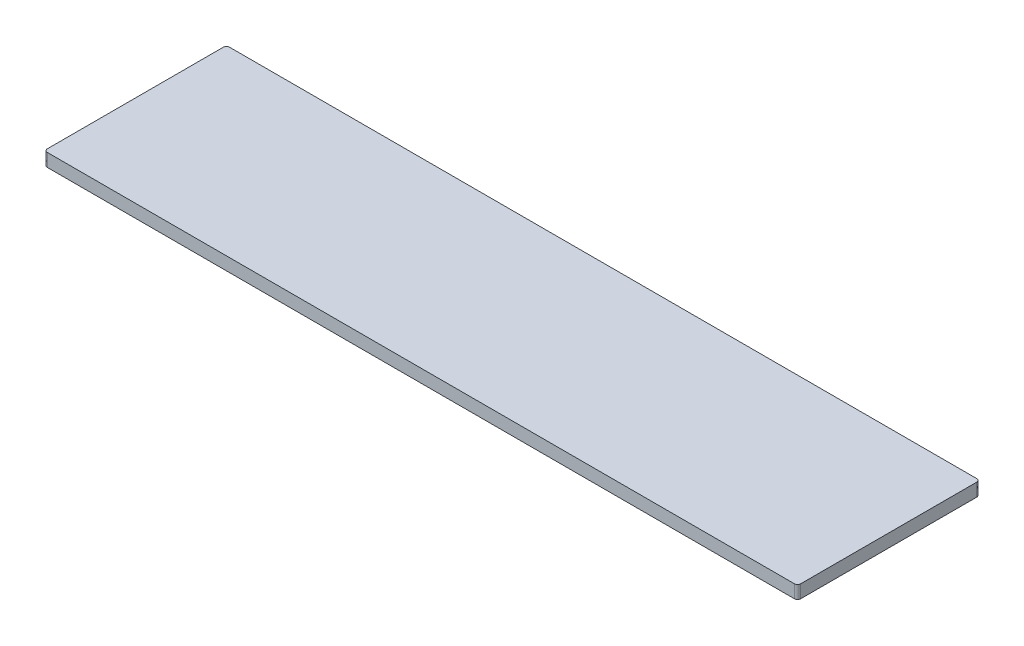
ISO-10303-21;
HEADER;
FILE_DESCRIPTION(('STEP AP214'),'2;1');
FILE_NAME('part.step','',(''),(''),'','','');
FILE_SCHEMA(('AUTOMOTIVE_DESIGN { 1 0 10303 214 1 1 1 1 }'));
ENDSEC;
DATA;
#1=APPLICATION_CONTEXT('core data for automotive mechanical design processes');
#2=APPLICATION_PROTOCOL_DEFINITION('international standard','automotive_design',2000,#1);
#3=PRODUCT_CONTEXT('',#1,'mechanical');
#4=PRODUCT('Part','Part','',(#3));
#5=PRODUCT_RELATED_PRODUCT_CATEGORY('part','',(#4));
#6=PRODUCT_DEFINITION_FORMATION('','',#4);
#7=PRODUCT_DEFINITION_CONTEXT('part definition',#1,'design');
#8=PRODUCT_DEFINITION('design','',#6,#7);
#9=PRODUCT_DEFINITION_SHAPE('','',#8);
#10=(LENGTH_UNIT() NAMED_UNIT(*) SI_UNIT(.MILLI.,.METRE.));
#11=(NAMED_UNIT(*) PLANE_ANGLE_UNIT() SI_UNIT($,.RADIAN.));
#12=(NAMED_UNIT(*) SI_UNIT($,.STERADIAN.) SOLID_ANGLE_UNIT());
#13=UNCERTAINTY_MEASURE_WITH_UNIT(LENGTH_MEASURE(1.E-05),#10,'distance_accuracy_value','');
#14=(GEOMETRIC_REPRESENTATION_CONTEXT(3) GLOBAL_UNCERTAINTY_ASSIGNED_CONTEXT((#13)) GLOBAL_UNIT_ASSIGNED_CONTEXT((#10,
#11,#12)) REPRESENTATION_CONTEXT('',''));
#15=CARTESIAN_POINT('',(0.,0.,0.));
#16=DIRECTION('',(0.,0.,1.));
#17=DIRECTION('',(1.,0.,0.));
#18=AXIS2_PLACEMENT_3D('',#15,#16,#17);
#19=CARTESIAN_POINT('',(367.5,12.7,88.9));
#20=DIRECTION('',(-1.,0.,0.));
#21=DIRECTION('',(0.,0.,1.));
#22=AXIS2_PLACEMENT_3D('',#19,#20,#21);
#23=PLANE('',#22);
#24=DIRECTION('',(0.,0.,-1.));
#25=VECTOR('',#24,1.);
#26=CARTESIAN_POINT('',(367.5,0.,88.9));
#27=LINE('',#26,#25);
#28=CARTESIAN_POINT('',(367.5,0.,85.9));
#29=VERTEX_POINT('',#28);
#30=CARTESIAN_POINT('',(367.5,0.,-85.9));
#31=VERTEX_POINT('',#30);
#32=EDGE_CURVE('E184',#29,#31,#27,.T.);
#33=ORIENTED_EDGE('',*,*,#32,.T.);
#34=DIRECTION('',(0.,-1.,0.));
#35=VECTOR('',#34,1.);
#36=CARTESIAN_POINT('',(367.5,12.7,-85.9));
#37=LINE('',#36,#35);
#38=CARTESIAN_POINT('',(367.5,12.7,-85.9));
#39=VERTEX_POINT('',#38);
#40=EDGE_CURVE('E11',#31,#39,#37,.F.);
#41=ORIENTED_EDGE('',*,*,#40,.T.);
#42=DIRECTION('',(0.,0.,-1.));
#43=VECTOR('',#42,1.);
#44=CARTESIAN_POINT('',(367.5,12.7,88.9));
#45=LINE('',#44,#43);
#46=CARTESIAN_POINT('',(367.5,12.7,85.9));
#47=VERTEX_POINT('',#46);
#48=EDGE_CURVE('E137',#47,#39,#45,.T.);
#49=ORIENTED_EDGE('',*,*,#48,.F.);
#50=DIRECTION('',(0.,-1.,0.));
#51=VECTOR('',#50,1.);
#52=CARTESIAN_POINT('',(367.5,12.7,85.9));
#53=LINE('',#52,#51);
#54=EDGE_CURVE('E50',#47,#29,#53,.T.);
#55=ORIENTED_EDGE('',*,*,#54,.T.);
#56=EDGE_LOOP('',(#33,#41,#49,#55));
#57=FACE_BOUND('',#56,.T.);
#58=ADVANCED_FACE('F41',(#57),#23,.F.);
#59=CARTESIAN_POINT('',(-367.5,12.7,-88.9));
#60=DIRECTION('',(0.,0.,1.));
#61=DIRECTION('',(1.,0.,0.));
#62=AXIS2_PLACEMENT_3D('',#59,#60,#61);
#63=PLANE('',#62);
#64=DIRECTION('',(-1.,0.,0.));
#65=VECTOR('',#64,1.);
#66=CARTESIAN_POINT('',(-367.5,0.,-88.9));
#67=LINE('',#66,#65);
#68=CARTESIAN_POINT('',(364.5,0.,-88.9));
#69=VERTEX_POINT('',#68);
#70=CARTESIAN_POINT('',(-364.5,0.,-88.9));
#71=VERTEX_POINT('',#70);
#72=EDGE_CURVE('E144',#69,#71,#67,.T.);
#73=ORIENTED_EDGE('',*,*,#72,.T.);
#74=DIRECTION('',(0.,-1.,0.));
#75=VECTOR('',#74,1.);
#76=CARTESIAN_POINT('',(-364.5,12.7,-88.9));
#77=LINE('',#76,#75);
#78=CARTESIAN_POINT('',(-364.5,12.7,-88.9));
#79=VERTEX_POINT('',#78);
#80=EDGE_CURVE('E57',#71,#79,#77,.F.);
#81=ORIENTED_EDGE('',*,*,#80,.T.);
#82=DIRECTION('',(-1.,0.,0.));
#83=VECTOR('',#82,1.);
#84=CARTESIAN_POINT('',(-367.5,12.7,-88.9));
#85=LINE('',#84,#83);
#86=CARTESIAN_POINT('',(364.5,12.7,-88.9));
#87=VERTEX_POINT('',#86);
#88=EDGE_CURVE('E142',#87,#79,#85,.T.);
#89=ORIENTED_EDGE('',*,*,#88,.F.);
#90=DIRECTION('',(0.,-1.,0.));
#91=VECTOR('',#90,1.);
#92=CARTESIAN_POINT('',(364.5,12.7,-88.9));
#93=LINE('',#92,#91);
#94=EDGE_CURVE('E173',#87,#69,#93,.T.);
#95=ORIENTED_EDGE('',*,*,#94,.T.);
#96=EDGE_LOOP('',(#73,#81,#89,#95));
#97=FACE_BOUND('',#96,.T.);
#98=ADVANCED_FACE('F209',(#97),#63,.F.);
#99=CARTESIAN_POINT('',(-367.5,12.7,88.9));
#100=DIRECTION('',(1.,0.,0.));
#101=DIRECTION('',(0.,0.,-1.));
#102=AXIS2_PLACEMENT_3D('',#99,#100,#101);
#103=PLANE('',#102);
#104=DIRECTION('',(0.,0.,1.));
#105=VECTOR('',#104,1.);
#106=CARTESIAN_POINT('',(-367.5,0.,88.9));
#107=LINE('',#106,#105);
#108=CARTESIAN_POINT('',(-367.5,0.,-85.9));
#109=VERTEX_POINT('',#108);
#110=CARTESIAN_POINT('',(-367.5,0.,85.9));
#111=VERTEX_POINT('',#110);
#112=EDGE_CURVE('E138',#109,#111,#107,.T.);
#113=ORIENTED_EDGE('',*,*,#112,.T.);
#114=DIRECTION('',(0.,-1.,0.));
#115=VECTOR('',#114,1.);
#116=CARTESIAN_POINT('',(-367.5,12.7,85.9));
#117=LINE('',#116,#115);
#118=CARTESIAN_POINT('',(-367.5,12.7,85.9));
#119=VERTEX_POINT('',#118);
#120=EDGE_CURVE('E113',#111,#119,#117,.F.);
#121=ORIENTED_EDGE('',*,*,#120,.T.);
#122=DIRECTION('',(0.,0.,1.));
#123=VECTOR('',#122,1.);
#124=CARTESIAN_POINT('',(-367.5,12.7,88.9));
#125=LINE('',#124,#123);
#126=CARTESIAN_POINT('',(-367.5,12.7,-85.9));
#127=VERTEX_POINT('',#126);
#128=EDGE_CURVE('E195',#127,#119,#125,.T.);
#129=ORIENTED_EDGE('',*,*,#128,.F.);
#130=DIRECTION('',(0.,-1.,0.));
#131=VECTOR('',#130,1.);
#132=CARTESIAN_POINT('',(-367.5,12.7,-85.9));
#133=LINE('',#132,#131);
#134=EDGE_CURVE('E119',#127,#109,#133,.T.);
#135=ORIENTED_EDGE('',*,*,#134,.T.);
#136=EDGE_LOOP('',(#113,#121,#129,#135));
#137=FACE_BOUND('',#136,.T.);
#138=ADVANCED_FACE('F208',(#137),#103,.F.);
#139=CARTESIAN_POINT('',(-367.5,12.7,88.9));
#140=DIRECTION('',(0.,0.,-1.));
#141=DIRECTION('',(-1.,0.,0.));
#142=AXIS2_PLACEMENT_3D('',#139,#140,#141);
#143=PLANE('',#142);
#144=DIRECTION('',(1.,0.,0.));
#145=VECTOR('',#144,1.);
#146=CARTESIAN_POINT('',(-367.5,12.7,88.9));
#147=LINE('',#146,#145);
#148=CARTESIAN_POINT('',(-364.5,12.7,88.9));
#149=VERTEX_POINT('',#148);
#150=CARTESIAN_POINT('',(364.5,12.7,88.9));
#151=VERTEX_POINT('',#150);
#152=EDGE_CURVE('E129',#149,#151,#147,.T.);
#153=ORIENTED_EDGE('',*,*,#152,.F.);
#154=DIRECTION('',(0.,-1.,0.));
#155=VECTOR('',#154,1.);
#156=CARTESIAN_POINT('',(-364.5,12.7,88.9));
#157=LINE('',#156,#155);
#158=CARTESIAN_POINT('',(-364.5,0.,88.9));
#159=VERTEX_POINT('',#158);
#160=EDGE_CURVE('E112',#149,#159,#157,.T.);
#161=ORIENTED_EDGE('',*,*,#160,.T.);
#162=DIRECTION('',(1.,0.,0.));
#163=VECTOR('',#162,1.);
#164=CARTESIAN_POINT('',(-367.5,0.,88.9));
#165=LINE('',#164,#163);
#166=CARTESIAN_POINT('',(364.5,0.,88.9));
#167=VERTEX_POINT('',#166);
#168=EDGE_CURVE('E126',#159,#167,#165,.T.);
#169=ORIENTED_EDGE('',*,*,#168,.T.);
#170=DIRECTION('',(0.,-1.,0.));
#171=VECTOR('',#170,1.);
#172=CARTESIAN_POINT('',(364.5,12.7,88.9));
#173=LINE('',#172,#171);
#174=EDGE_CURVE('E132',#167,#151,#173,.F.);
#175=ORIENTED_EDGE('',*,*,#174,.T.);
#176=EDGE_LOOP('',(#153,#161,#169,#175));
#177=FACE_BOUND('',#176,.T.);
#178=ADVANCED_FACE('F125',(#177),#143,.F.);
#179=CARTESIAN_POINT('',(0.,12.7,0.));
#180=DIRECTION('',(0.,-1.,0.));
#181=DIRECTION('',(0.,0.,-1.));
#182=AXIS2_PLACEMENT_3D('',#179,#180,#181);
#183=PLANE('',#182);
#184=ORIENTED_EDGE('',*,*,#128,.T.);
#185=CARTESIAN_POINT('',(-364.5,12.7,85.9));
#186=DIRECTION('',(0.,-1.,0.));
#187=DIRECTION('',(0.,0.,-1.));
#188=AXIS2_PLACEMENT_3D('',#185,#186,#187);
#189=CIRCLE('',#188,3.);
#190=EDGE_CURVE('E170',#119,#149,#189,.F.);
#191=ORIENTED_EDGE('',*,*,#190,.T.);
#192=ORIENTED_EDGE('',*,*,#152,.T.);
#193=CARTESIAN_POINT('',(364.5,12.7,85.9));
#194=DIRECTION('',(0.,-1.,0.));
#195=DIRECTION('',(0.,0.,-1.));
#196=AXIS2_PLACEMENT_3D('',#193,#194,#195);
#197=CIRCLE('',#196,3.);
#198=EDGE_CURVE('E162',#151,#47,#197,.F.);
#199=ORIENTED_EDGE('',*,*,#198,.T.);
#200=ORIENTED_EDGE('',*,*,#48,.T.);
#201=CARTESIAN_POINT('',(364.5,12.7,-85.9));
#202=DIRECTION('',(0.,-1.,0.));
#203=DIRECTION('',(0.,0.,-1.));
#204=AXIS2_PLACEMENT_3D('',#201,#202,#203);
#205=CIRCLE('',#204,3.);
#206=EDGE_CURVE('E64',#39,#87,#205,.F.);
#207=ORIENTED_EDGE('',*,*,#206,.T.);
#208=ORIENTED_EDGE('',*,*,#88,.T.);
#209=CARTESIAN_POINT('',(-364.5,12.7,-85.9));
#210=DIRECTION('',(0.,-1.,0.));
#211=DIRECTION('',(0.,0.,-1.));
#212=AXIS2_PLACEMENT_3D('',#209,#210,#211);
#213=CIRCLE('',#212,3.);
#214=EDGE_CURVE('E167',#79,#127,#213,.F.);
#215=ORIENTED_EDGE('',*,*,#214,.T.);
#216=EDGE_LOOP('',(#184,#191,#192,#199,#200,#207,#208,#215));
#217=FACE_BOUND('',#216,.T.);
#218=ADVANCED_FACE('F201',(#217),#183,.F.);
#219=CARTESIAN_POINT('',(0.,0.,0.));
#220=DIRECTION('',(0.,-1.,0.));
#221=DIRECTION('',(0.,0.,-1.));
#222=AXIS2_PLACEMENT_3D('',#219,#220,#221);
#223=PLANE('',#222);
#224=ORIENTED_EDGE('',*,*,#168,.F.);
#225=CARTESIAN_POINT('',(-364.5,0.,85.9));
#226=DIRECTION('',(0.,-1.,0.));
#227=DIRECTION('',(0.,0.,-1.));
#228=AXIS2_PLACEMENT_3D('',#225,#226,#227);
#229=CIRCLE('',#228,3.);
#230=EDGE_CURVE('E108',#159,#111,#229,.T.);
#231=ORIENTED_EDGE('',*,*,#230,.T.);
#232=ORIENTED_EDGE('',*,*,#112,.F.);
#233=CARTESIAN_POINT('',(-364.5,0.,-85.9));
#234=DIRECTION('',(0.,-1.,0.));
#235=DIRECTION('',(0.,0.,-1.));
#236=AXIS2_PLACEMENT_3D('',#233,#234,#235);
#237=CIRCLE('',#236,3.);
#238=EDGE_CURVE('E120',#109,#71,#237,.T.);
#239=ORIENTED_EDGE('',*,*,#238,.T.);
#240=ORIENTED_EDGE('',*,*,#72,.F.);
#241=CARTESIAN_POINT('',(364.5,0.,-85.9));
#242=DIRECTION('',(0.,-1.,0.));
#243=DIRECTION('',(0.,0.,-1.));
#244=AXIS2_PLACEMENT_3D('',#241,#242,#243);
#245=CIRCLE('',#244,3.);
#246=EDGE_CURVE('E152',#69,#31,#245,.T.);
#247=ORIENTED_EDGE('',*,*,#246,.T.);
#248=ORIENTED_EDGE('',*,*,#32,.F.);
#249=CARTESIAN_POINT('',(364.5,0.,85.9));
#250=DIRECTION('',(0.,-1.,0.));
#251=DIRECTION('',(0.,0.,-1.));
#252=AXIS2_PLACEMENT_3D('',#249,#250,#251);
#253=CIRCLE('',#252,3.);
#254=EDGE_CURVE('E131',#29,#167,#253,.T.);
#255=ORIENTED_EDGE('',*,*,#254,.T.);
#256=EDGE_LOOP('',(#224,#231,#232,#239,#240,#247,#248,#255));
#257=FACE_BOUND('',#256,.T.);
#258=ADVANCED_FACE('F134',(#257),#223,.T.);
#259=CARTESIAN_POINT('',(-364.5,12.7,85.9));
#260=DIRECTION('',(0.,-1.,0.));
#261=DIRECTION('',(0.,0.,-1.));
#262=AXIS2_PLACEMENT_3D('',#259,#260,#261);
#263=CYLINDRICAL_SURFACE('',#262,3.);
#264=ORIENTED_EDGE('',*,*,#190,.F.);
#265=ORIENTED_EDGE('',*,*,#120,.F.);
#266=ORIENTED_EDGE('',*,*,#230,.F.);
#267=ORIENTED_EDGE('',*,*,#160,.F.);
#268=EDGE_LOOP('',(#264,#265,#266,#267));
#269=FACE_BOUND('',#268,.T.);
#270=ADVANCED_FACE('F111',(#269),#263,.T.);
#271=CARTESIAN_POINT('',(-364.5,12.7,-85.9));
#272=DIRECTION('',(0.,-1.,0.));
#273=DIRECTION('',(0.,0.,-1.));
#274=AXIS2_PLACEMENT_3D('',#271,#272,#273);
#275=CYLINDRICAL_SURFACE('',#274,3.);
#276=ORIENTED_EDGE('',*,*,#214,.F.);
#277=ORIENTED_EDGE('',*,*,#80,.F.);
#278=ORIENTED_EDGE('',*,*,#238,.F.);
#279=ORIENTED_EDGE('',*,*,#134,.F.);
#280=EDGE_LOOP('',(#276,#277,#278,#279));
#281=FACE_BOUND('',#280,.T.);
#282=ADVANCED_FACE('F206',(#281),#275,.T.);
#283=CARTESIAN_POINT('',(364.5,12.7,-85.9));
#284=DIRECTION('',(0.,-1.,0.));
#285=DIRECTION('',(0.,0.,-1.));
#286=AXIS2_PLACEMENT_3D('',#283,#284,#285);
#287=CYLINDRICAL_SURFACE('',#286,3.);
#288=ORIENTED_EDGE('',*,*,#206,.F.);
#289=ORIENTED_EDGE('',*,*,#40,.F.);
#290=ORIENTED_EDGE('',*,*,#246,.F.);
#291=ORIENTED_EDGE('',*,*,#94,.F.);
#292=EDGE_LOOP('',(#288,#289,#290,#291));
#293=FACE_BOUND('',#292,.T.);
#294=ADVANCED_FACE('F211',(#293),#287,.T.);
#295=CARTESIAN_POINT('',(364.5,12.7,85.9));
#296=DIRECTION('',(0.,-1.,0.));
#297=DIRECTION('',(0.,0.,-1.));
#298=AXIS2_PLACEMENT_3D('',#295,#296,#297);
#299=CYLINDRICAL_SURFACE('',#298,3.);
#300=ORIENTED_EDGE('',*,*,#198,.F.);
#301=ORIENTED_EDGE('',*,*,#174,.F.);
#302=ORIENTED_EDGE('',*,*,#254,.F.);
#303=ORIENTED_EDGE('',*,*,#54,.F.);
#304=EDGE_LOOP('',(#300,#301,#302,#303));
#305=FACE_BOUND('',#304,.T.);
#306=ADVANCED_FACE('F43',(#305),#299,.T.);
#307=CLOSED_SHELL('',(#58,#98,#138,#178,#218,#258,#270,#282,#294,#306));
#308=MANIFOLD_SOLID_BREP('B2',#307);
#309=ADVANCED_BREP_SHAPE_REPRESENTATION('',(#18,#308),#14);
#310=SHAPE_DEFINITION_REPRESENTATION(#9,#309);
ENDSEC;
END-ISO-10303-21;
